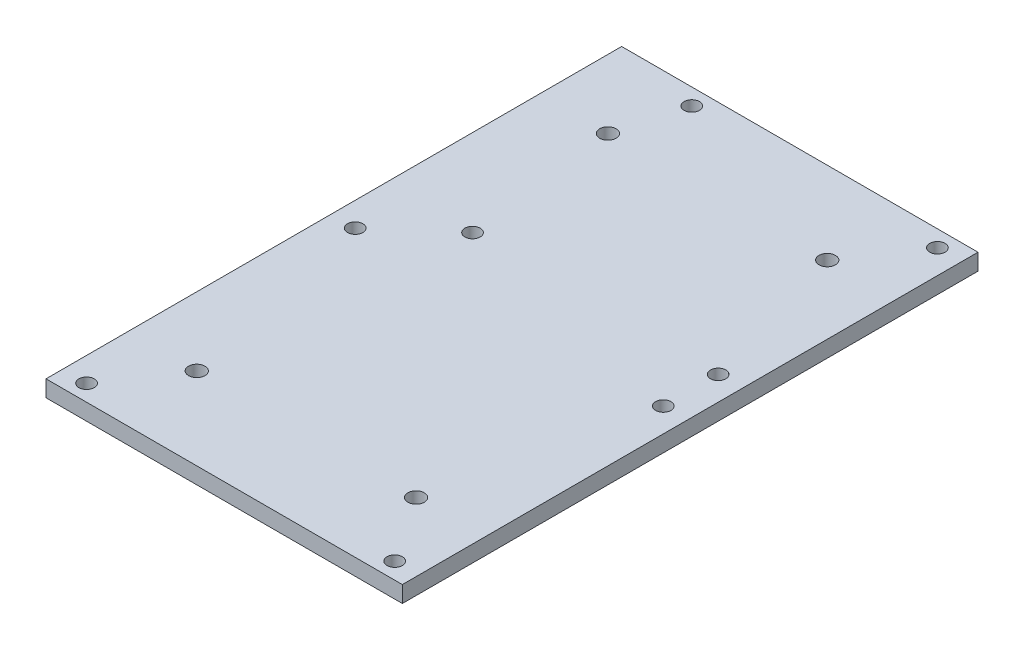
ISO-10303-21;
HEADER;
FILE_DESCRIPTION(('STEP AP214'),'2;1');
FILE_NAME('part.step','',(''),(''),'','','');
FILE_SCHEMA(('AUTOMOTIVE_DESIGN { 1 0 10303 214 1 1 1 1 }'));
ENDSEC;
DATA;
#1=APPLICATION_CONTEXT('core data for automotive mechanical design processes');
#2=APPLICATION_PROTOCOL_DEFINITION('international standard','automotive_design',2000,#1);
#3=PRODUCT_CONTEXT('',#1,'mechanical');
#4=PRODUCT('Part','Part','',(#3));
#5=PRODUCT_RELATED_PRODUCT_CATEGORY('part','',(#4));
#6=PRODUCT_DEFINITION_FORMATION('','',#4);
#7=PRODUCT_DEFINITION_CONTEXT('part definition',#1,'design');
#8=PRODUCT_DEFINITION('design','',#6,#7);
#9=PRODUCT_DEFINITION_SHAPE('','',#8);
#10=(LENGTH_UNIT() NAMED_UNIT(*) SI_UNIT(.MILLI.,.METRE.));
#11=(NAMED_UNIT(*) PLANE_ANGLE_UNIT() SI_UNIT($,.RADIAN.));
#12=(NAMED_UNIT(*) SI_UNIT($,.STERADIAN.) SOLID_ANGLE_UNIT());
#13=UNCERTAINTY_MEASURE_WITH_UNIT(LENGTH_MEASURE(1.E-05),#10,'distance_accuracy_value','');
#14=(GEOMETRIC_REPRESENTATION_CONTEXT(3) GLOBAL_UNCERTAINTY_ASSIGNED_CONTEXT((#13)) GLOBAL_UNIT_ASSIGNED_CONTEXT((#10,
#11,#12)) REPRESENTATION_CONTEXT('',''));
#15=CARTESIAN_POINT('',(0.,0.,0.));
#16=DIRECTION('',(0.,0.,1.));
#17=DIRECTION('',(1.,0.,0.));
#18=AXIS2_PLACEMENT_3D('',#15,#16,#17);
#19=CARTESIAN_POINT('',(32.5,3.,-52.5));
#20=DIRECTION('',(-1.,0.,0.));
#21=DIRECTION('',(0.,0.,1.));
#22=AXIS2_PLACEMENT_3D('',#19,#20,#21);
#23=PLANE('',#22);
#24=DIRECTION('',(0.,0.,-1.));
#25=VECTOR('',#24,1.);
#26=CARTESIAN_POINT('',(32.5,0.,-52.5));
#27=LINE('',#26,#25);
#28=CARTESIAN_POINT('',(32.5,0.,52.5));
#29=VERTEX_POINT('',#28);
#30=CARTESIAN_POINT('',(32.5,0.,-52.5));
#31=VERTEX_POINT('',#30);
#32=EDGE_CURVE('E100',#29,#31,#27,.T.);
#33=ORIENTED_EDGE('',*,*,#32,.T.);
#34=DIRECTION('',(0.,-1.,0.));
#35=VECTOR('',#34,1.);
#36=CARTESIAN_POINT('',(32.5,3.,-52.5));
#37=LINE('',#36,#35);
#38=CARTESIAN_POINT('',(32.5,3.,-52.5));
#39=VERTEX_POINT('',#38);
#40=EDGE_CURVE('E11',#39,#31,#37,.T.);
#41=ORIENTED_EDGE('',*,*,#40,.F.);
#42=DIRECTION('',(0.,0.,-1.));
#43=VECTOR('',#42,1.);
#44=CARTESIAN_POINT('',(32.5,3.,-52.5));
#45=LINE('',#44,#43);
#46=CARTESIAN_POINT('',(32.5,3.,52.5));
#47=VERTEX_POINT('',#46);
#48=EDGE_CURVE('E88',#47,#39,#45,.T.);
#49=ORIENTED_EDGE('',*,*,#48,.F.);
#50=DIRECTION('',(0.,-1.,0.));
#51=VECTOR('',#50,1.);
#52=CARTESIAN_POINT('',(32.5,3.,52.5));
#53=LINE('',#52,#51);
#54=EDGE_CURVE('E96',#47,#29,#53,.T.);
#55=ORIENTED_EDGE('',*,*,#54,.T.);
#56=EDGE_LOOP('',(#33,#41,#49,#55));
#57=FACE_BOUND('',#56,.T.);
#58=ADVANCED_FACE('F37',(#57),#23,.F.);
#59=CARTESIAN_POINT('',(-32.5,3.,-52.5));
#60=DIRECTION('',(0.,0.,1.));
#61=DIRECTION('',(1.,0.,0.));
#62=AXIS2_PLACEMENT_3D('',#59,#60,#61);
#63=PLANE('',#62);
#64=DIRECTION('',(-1.,0.,0.));
#65=VECTOR('',#64,1.);
#66=CARTESIAN_POINT('',(-32.5,0.,-52.5));
#67=LINE('',#66,#65);
#68=CARTESIAN_POINT('',(-32.5,0.,-52.5));
#69=VERTEX_POINT('',#68);
#70=EDGE_CURVE('E92',#31,#69,#67,.T.);
#71=ORIENTED_EDGE('',*,*,#70,.T.);
#72=DIRECTION('',(0.,-1.,0.));
#73=VECTOR('',#72,1.);
#74=CARTESIAN_POINT('',(-32.5,3.,-52.5));
#75=LINE('',#74,#73);
#76=CARTESIAN_POINT('',(-32.5,3.,-52.5));
#77=VERTEX_POINT('',#76);
#78=EDGE_CURVE('E45',#77,#69,#75,.T.);
#79=ORIENTED_EDGE('',*,*,#78,.F.);
#80=DIRECTION('',(-1.,0.,0.));
#81=VECTOR('',#80,1.);
#82=CARTESIAN_POINT('',(-32.5,3.,-52.5));
#83=LINE('',#82,#81);
#84=EDGE_CURVE('E83',#39,#77,#83,.T.);
#85=ORIENTED_EDGE('',*,*,#84,.F.);
#86=ORIENTED_EDGE('',*,*,#40,.T.);
#87=EDGE_LOOP('',(#71,#79,#85,#86));
#88=FACE_BOUND('',#87,.T.);
#89=ADVANCED_FACE('F91',(#88),#63,.F.);
#90=CARTESIAN_POINT('',(-32.5,3.,-52.5));
#91=DIRECTION('',(1.,0.,0.));
#92=DIRECTION('',(0.,0.,-1.));
#93=AXIS2_PLACEMENT_3D('',#90,#91,#92);
#94=PLANE('',#93);
#95=DIRECTION('',(0.,0.,1.));
#96=VECTOR('',#95,1.);
#97=CARTESIAN_POINT('',(-32.5,0.,-52.5));
#98=LINE('',#97,#96);
#99=CARTESIAN_POINT('',(-32.5,0.,52.5));
#100=VERTEX_POINT('',#99);
#101=EDGE_CURVE('E70',#69,#100,#98,.T.);
#102=ORIENTED_EDGE('',*,*,#101,.T.);
#103=DIRECTION('',(0.,-1.,0.));
#104=VECTOR('',#103,1.);
#105=CARTESIAN_POINT('',(-32.5,3.,52.5));
#106=LINE('',#105,#104);
#107=CARTESIAN_POINT('',(-32.5,3.,52.5));
#108=VERTEX_POINT('',#107);
#109=EDGE_CURVE('E93',#108,#100,#106,.T.);
#110=ORIENTED_EDGE('',*,*,#109,.F.);
#111=DIRECTION('',(0.,0.,1.));
#112=VECTOR('',#111,1.);
#113=CARTESIAN_POINT('',(-32.5,3.,-52.5));
#114=LINE('',#113,#112);
#115=EDGE_CURVE('E86',#77,#108,#114,.T.);
#116=ORIENTED_EDGE('',*,*,#115,.F.);
#117=ORIENTED_EDGE('',*,*,#78,.T.);
#118=EDGE_LOOP('',(#102,#110,#116,#117));
#119=FACE_BOUND('',#118,.T.);
#120=ADVANCED_FACE('F94',(#119),#94,.F.);
#121=CARTESIAN_POINT('',(-32.5,3.,52.5));
#122=DIRECTION('',(0.,0.,-1.));
#123=DIRECTION('',(-1.,0.,0.));
#124=AXIS2_PLACEMENT_3D('',#121,#122,#123);
#125=PLANE('',#124);
#126=DIRECTION('',(1.,0.,0.));
#127=VECTOR('',#126,1.);
#128=CARTESIAN_POINT('',(-32.5,0.,52.5));
#129=LINE('',#128,#127);
#130=EDGE_CURVE('E76',#100,#29,#129,.T.);
#131=ORIENTED_EDGE('',*,*,#130,.T.);
#132=ORIENTED_EDGE('',*,*,#54,.F.);
#133=DIRECTION('',(1.,0.,0.));
#134=VECTOR('',#133,1.);
#135=CARTESIAN_POINT('',(-32.5,3.,52.5));
#136=LINE('',#135,#134);
#137=EDGE_CURVE('E53',#108,#47,#136,.T.);
#138=ORIENTED_EDGE('',*,*,#137,.F.);
#139=ORIENTED_EDGE('',*,*,#109,.T.);
#140=EDGE_LOOP('',(#131,#132,#138,#139));
#141=FACE_BOUND('',#140,.T.);
#142=ADVANCED_FACE('F108',(#141),#125,.F.);
#143=CARTESIAN_POINT('',(0.,3.,0.));
#144=DIRECTION('',(0.,1.,0.));
#145=DIRECTION('',(0.,0.,1.));
#146=AXIS2_PLACEMENT_3D('',#143,#144,#145);
#147=PLANE('',#146);
#148=CARTESIAN_POINT('',(20.,3.,37.5));
#149=DIRECTION('',(0.,1.,0.));
#150=DIRECTION('',(0.,0.,1.));
#151=AXIS2_PLACEMENT_3D('',#148,#149,#150);
#152=CIRCLE('',#151,1.5);
#153=CARTESIAN_POINT('',(20.,3.,39.));
#154=VERTEX_POINT('',#153);
#155=EDGE_CURVE('E180',#154,#154,#152,.T.);
#156=ORIENTED_EDGE('',*,*,#155,.F.);
#157=EDGE_LOOP('',(#156));
#158=FACE_BOUND('',#157,.T.);
#159=CARTESIAN_POINT('',(20.,3.,-37.5));
#160=DIRECTION('',(0.,1.,0.));
#161=DIRECTION('',(0.,0.,1.));
#162=AXIS2_PLACEMENT_3D('',#159,#160,#161);
#163=CIRCLE('',#162,1.5);
#164=CARTESIAN_POINT('',(20.,3.,-36.));
#165=VERTEX_POINT('',#164);
#166=EDGE_CURVE('E174',#165,#165,#163,.T.);
#167=ORIENTED_EDGE('',*,*,#166,.F.);
#168=EDGE_LOOP('',(#167));
#169=FACE_BOUND('',#168,.T.);
#170=CARTESIAN_POINT('',(-20.,3.,-37.5));
#171=DIRECTION('',(0.,1.,0.));
#172=DIRECTION('',(0.,0.,1.));
#173=AXIS2_PLACEMENT_3D('',#170,#171,#172);
#174=CIRCLE('',#173,1.5);
#175=CARTESIAN_POINT('',(-20.,3.,-36.));
#176=VERTEX_POINT('',#175);
#177=EDGE_CURVE('E168',#176,#176,#174,.T.);
#178=ORIENTED_EDGE('',*,*,#177,.F.);
#179=EDGE_LOOP('',(#178));
#180=FACE_BOUND('',#179,.T.);
#181=CARTESIAN_POINT('',(-20.,3.,37.5));
#182=DIRECTION('',(0.,1.,0.));
#183=DIRECTION('',(0.,0.,1.));
#184=AXIS2_PLACEMENT_3D('',#181,#182,#183);
#185=CIRCLE('',#184,1.5);
#186=CARTESIAN_POINT('',(-20.,3.,39.));
#187=VERTEX_POINT('',#186);
#188=EDGE_CURVE('E162',#187,#187,#185,.T.);
#189=ORIENTED_EDGE('',*,*,#188,.F.);
#190=EDGE_LOOP('',(#189));
#191=FACE_BOUND('',#190,.T.);
#192=CARTESIAN_POINT('',(28.1000000000001,3.,-9.5));
#193=DIRECTION('',(0.,1.,0.));
#194=DIRECTION('',(0.,0.,1.));
#195=AXIS2_PLACEMENT_3D('',#192,#193,#194);
#196=CIRCLE('',#195,1.4);
#197=CARTESIAN_POINT('',(28.1000000000001,3.,-8.1));
#198=VERTEX_POINT('',#197);
#199=EDGE_CURVE('E157',#198,#198,#196,.T.);
#200=ORIENTED_EDGE('',*,*,#199,.F.);
#201=EDGE_LOOP('',(#200));
#202=FACE_BOUND('',#201,.T.);
#203=CARTESIAN_POINT('',(28.1000000000001,3.,-49.5));
#204=DIRECTION('',(0.,1.,0.));
#205=DIRECTION('',(0.,0.,1.));
#206=AXIS2_PLACEMENT_3D('',#203,#204,#205);
#207=CIRCLE('',#206,1.4);
#208=CARTESIAN_POINT('',(28.1000000000001,3.,-48.1));
#209=VERTEX_POINT('',#208);
#210=EDGE_CURVE('E151',#209,#209,#207,.T.);
#211=ORIENTED_EDGE('',*,*,#210,.F.);
#212=EDGE_LOOP('',(#211));
#213=FACE_BOUND('',#212,.T.);
#214=CARTESIAN_POINT('',(-16.6999999999999,3.,-49.5));
#215=DIRECTION('',(0.,1.,0.));
#216=DIRECTION('',(0.,0.,1.));
#217=AXIS2_PLACEMENT_3D('',#214,#215,#216);
#218=CIRCLE('',#217,1.4);
#219=CARTESIAN_POINT('',(-16.6999999999999,3.,-48.1));
#220=VERTEX_POINT('',#219);
#221=EDGE_CURVE('E144',#220,#220,#218,.T.);
#222=ORIENTED_EDGE('',*,*,#221,.F.);
#223=EDGE_LOOP('',(#222));
#224=FACE_BOUND('',#223,.T.);
#225=CARTESIAN_POINT('',(-16.6999999999999,3.,-9.5));
#226=DIRECTION('',(0.,1.,0.));
#227=DIRECTION('',(0.,0.,1.));
#228=AXIS2_PLACEMENT_3D('',#225,#226,#227);
#229=CIRCLE('',#228,1.4);
#230=CARTESIAN_POINT('',(-16.6999999999999,3.,-8.1));
#231=VERTEX_POINT('',#230);
#232=EDGE_CURVE('E138',#231,#231,#229,.T.);
#233=ORIENTED_EDGE('',*,*,#232,.F.);
#234=EDGE_LOOP('',(#233));
#235=FACE_BOUND('',#234,.T.);
#236=CARTESIAN_POINT('',(28.1000000000001,3.,49.5));
#237=DIRECTION('',(0.,1.,0.));
#238=DIRECTION('',(0.,0.,1.));
#239=AXIS2_PLACEMENT_3D('',#236,#237,#238);
#240=CIRCLE('',#239,1.4);
#241=CARTESIAN_POINT('',(28.1000000000001,3.,50.9));
#242=VERTEX_POINT('',#241);
#243=EDGE_CURVE('E133',#242,#242,#240,.T.);
#244=ORIENTED_EDGE('',*,*,#243,.F.);
#245=EDGE_LOOP('',(#244));
#246=FACE_BOUND('',#245,.T.);
#247=CARTESIAN_POINT('',(28.1000000000001,3.,0.499999999999987));
#248=DIRECTION('',(0.,1.,0.));
#249=DIRECTION('',(0.,0.,1.));
#250=AXIS2_PLACEMENT_3D('',#247,#248,#249);
#251=CIRCLE('',#250,1.4);
#252=CARTESIAN_POINT('',(28.1000000000001,3.,1.89999999999999));
#253=VERTEX_POINT('',#252);
#254=EDGE_CURVE('E127',#253,#253,#251,.T.);
#255=ORIENTED_EDGE('',*,*,#254,.F.);
#256=EDGE_LOOP('',(#255));
#257=FACE_BOUND('',#256,.T.);
#258=CARTESIAN_POINT('',(-28.0999999999999,3.,0.499999999999987));
#259=DIRECTION('',(0.,1.,0.));
#260=DIRECTION('',(0.,0.,1.));
#261=AXIS2_PLACEMENT_3D('',#258,#259,#260);
#262=CIRCLE('',#261,1.4);
#263=CARTESIAN_POINT('',(-28.0999999999999,3.,1.89999999999999));
#264=VERTEX_POINT('',#263);
#265=EDGE_CURVE('E120',#264,#264,#262,.T.);
#266=ORIENTED_EDGE('',*,*,#265,.F.);
#267=EDGE_LOOP('',(#266));
#268=FACE_BOUND('',#267,.T.);
#269=CARTESIAN_POINT('',(-28.0999999999999,3.,49.5));
#270=DIRECTION('',(0.,1.,0.));
#271=DIRECTION('',(0.,0.,1.));
#272=AXIS2_PLACEMENT_3D('',#269,#270,#271);
#273=CIRCLE('',#272,1.4);
#274=CARTESIAN_POINT('',(-28.0999999999999,3.,50.9));
#275=VERTEX_POINT('',#274);
#276=EDGE_CURVE('E114',#275,#275,#273,.T.);
#277=ORIENTED_EDGE('',*,*,#276,.F.);
#278=EDGE_LOOP('',(#277));
#279=FACE_BOUND('',#278,.T.);
#280=ORIENTED_EDGE('',*,*,#48,.T.);
#281=ORIENTED_EDGE('',*,*,#84,.T.);
#282=ORIENTED_EDGE('',*,*,#115,.T.);
#283=ORIENTED_EDGE('',*,*,#137,.T.);
#284=EDGE_LOOP('',(#280,#281,#282,#283));
#285=FACE_BOUND('',#284,.T.);
#286=ADVANCED_FACE('F84',(#158,#169,#180,#191,#202,#213,#224,#235,#246,#257,#268,#279,#285),
#147,.T.);
#287=CARTESIAN_POINT('',(0.,0.,0.));
#288=DIRECTION('',(0.,1.,0.));
#289=DIRECTION('',(0.,0.,1.));
#290=AXIS2_PLACEMENT_3D('',#287,#288,#289);
#291=PLANE('',#290);
#292=CARTESIAN_POINT('',(20.,0.,37.5));
#293=DIRECTION('',(0.,1.,0.));
#294=DIRECTION('',(0.,0.,1.));
#295=AXIS2_PLACEMENT_3D('',#292,#293,#294);
#296=CIRCLE('',#295,1.5);
#297=CARTESIAN_POINT('',(20.,0.,39.));
#298=VERTEX_POINT('',#297);
#299=EDGE_CURVE('E165',#298,#298,#296,.T.);
#300=ORIENTED_EDGE('',*,*,#299,.T.);
#301=EDGE_LOOP('',(#300));
#302=FACE_BOUND('',#301,.T.);
#303=CARTESIAN_POINT('',(20.,0.,-37.5));
#304=DIRECTION('',(0.,1.,0.));
#305=DIRECTION('',(0.,0.,1.));
#306=AXIS2_PLACEMENT_3D('',#303,#304,#305);
#307=CIRCLE('',#306,1.5);
#308=CARTESIAN_POINT('',(20.,0.,-36.));
#309=VERTEX_POINT('',#308);
#310=EDGE_CURVE('E177',#309,#309,#307,.T.);
#311=ORIENTED_EDGE('',*,*,#310,.T.);
#312=EDGE_LOOP('',(#311));
#313=FACE_BOUND('',#312,.T.);
#314=CARTESIAN_POINT('',(-20.,0.,-37.5));
#315=DIRECTION('',(0.,1.,0.));
#316=DIRECTION('',(0.,0.,1.));
#317=AXIS2_PLACEMENT_3D('',#314,#315,#316);
#318=CIRCLE('',#317,1.5);
#319=CARTESIAN_POINT('',(-20.,0.,-36.));
#320=VERTEX_POINT('',#319);
#321=EDGE_CURVE('E171',#320,#320,#318,.T.);
#322=ORIENTED_EDGE('',*,*,#321,.T.);
#323=EDGE_LOOP('',(#322));
#324=FACE_BOUND('',#323,.T.);
#325=CARTESIAN_POINT('',(-20.,0.,37.5));
#326=DIRECTION('',(0.,1.,0.));
#327=DIRECTION('',(0.,0.,1.));
#328=AXIS2_PLACEMENT_3D('',#325,#326,#327);
#329=CIRCLE('',#328,1.5);
#330=CARTESIAN_POINT('',(-20.,0.,39.));
#331=VERTEX_POINT('',#330);
#332=EDGE_CURVE('E148',#331,#331,#329,.T.);
#333=ORIENTED_EDGE('',*,*,#332,.T.);
#334=EDGE_LOOP('',(#333));
#335=FACE_BOUND('',#334,.T.);
#336=CARTESIAN_POINT('',(28.1000000000001,0.,-9.5));
#337=DIRECTION('',(0.,1.,0.));
#338=DIRECTION('',(0.,0.,1.));
#339=AXIS2_PLACEMENT_3D('',#336,#337,#338);
#340=CIRCLE('',#339,1.4);
#341=CARTESIAN_POINT('',(28.1000000000001,0.,-8.1));
#342=VERTEX_POINT('',#341);
#343=EDGE_CURVE('E141',#342,#342,#340,.T.);
#344=ORIENTED_EDGE('',*,*,#343,.T.);
#345=EDGE_LOOP('',(#344));
#346=FACE_BOUND('',#345,.T.);
#347=CARTESIAN_POINT('',(28.1000000000001,0.,-49.5));
#348=DIRECTION('',(0.,1.,0.));
#349=DIRECTION('',(0.,0.,1.));
#350=AXIS2_PLACEMENT_3D('',#347,#348,#349);
#351=CIRCLE('',#350,1.4);
#352=CARTESIAN_POINT('',(28.1000000000001,0.,-48.1));
#353=VERTEX_POINT('',#352);
#354=EDGE_CURVE('E154',#353,#353,#351,.T.);
#355=ORIENTED_EDGE('',*,*,#354,.T.);
#356=EDGE_LOOP('',(#355));
#357=FACE_BOUND('',#356,.T.);
#358=CARTESIAN_POINT('',(-16.6999999999999,0.,-49.5));
#359=DIRECTION('',(0.,1.,0.));
#360=DIRECTION('',(0.,0.,1.));
#361=AXIS2_PLACEMENT_3D('',#358,#359,#360);
#362=CIRCLE('',#361,1.4);
#363=CARTESIAN_POINT('',(-16.6999999999999,0.,-48.1));
#364=VERTEX_POINT('',#363);
#365=EDGE_CURVE('E147',#364,#364,#362,.T.);
#366=ORIENTED_EDGE('',*,*,#365,.T.);
#367=EDGE_LOOP('',(#366));
#368=FACE_BOUND('',#367,.T.);
#369=CARTESIAN_POINT('',(-16.6999999999999,0.,-9.5));
#370=DIRECTION('',(0.,1.,0.));
#371=DIRECTION('',(0.,0.,1.));
#372=AXIS2_PLACEMENT_3D('',#369,#370,#371);
#373=CIRCLE('',#372,1.4);
#374=CARTESIAN_POINT('',(-16.6999999999999,0.,-8.1));
#375=VERTEX_POINT('',#374);
#376=EDGE_CURVE('E124',#375,#375,#373,.T.);
#377=ORIENTED_EDGE('',*,*,#376,.T.);
#378=EDGE_LOOP('',(#377));
#379=FACE_BOUND('',#378,.T.);
#380=CARTESIAN_POINT('',(28.1000000000001,0.,49.5));
#381=DIRECTION('',(0.,1.,0.));
#382=DIRECTION('',(0.,0.,1.));
#383=AXIS2_PLACEMENT_3D('',#380,#381,#382);
#384=CIRCLE('',#383,1.4);
#385=CARTESIAN_POINT('',(28.1000000000001,0.,50.9));
#386=VERTEX_POINT('',#385);
#387=EDGE_CURVE('E117',#386,#386,#384,.T.);
#388=ORIENTED_EDGE('',*,*,#387,.T.);
#389=EDGE_LOOP('',(#388));
#390=FACE_BOUND('',#389,.T.);
#391=CARTESIAN_POINT('',(28.1000000000001,0.,0.499999999999987));
#392=DIRECTION('',(0.,1.,0.));
#393=DIRECTION('',(0.,0.,1.));
#394=AXIS2_PLACEMENT_3D('',#391,#392,#393);
#395=CIRCLE('',#394,1.4);
#396=CARTESIAN_POINT('',(28.1000000000001,0.,1.89999999999999));
#397=VERTEX_POINT('',#396);
#398=EDGE_CURVE('E130',#397,#397,#395,.T.);
#399=ORIENTED_EDGE('',*,*,#398,.T.);
#400=EDGE_LOOP('',(#399));
#401=FACE_BOUND('',#400,.T.);
#402=CARTESIAN_POINT('',(-28.0999999999999,0.,0.499999999999987));
#403=DIRECTION('',(0.,1.,0.));
#404=DIRECTION('',(0.,0.,1.));
#405=AXIS2_PLACEMENT_3D('',#402,#403,#404);
#406=CIRCLE('',#405,1.4);
#407=CARTESIAN_POINT('',(-28.0999999999999,0.,1.89999999999999));
#408=VERTEX_POINT('',#407);
#409=EDGE_CURVE('E123',#408,#408,#406,.T.);
#410=ORIENTED_EDGE('',*,*,#409,.T.);
#411=EDGE_LOOP('',(#410));
#412=FACE_BOUND('',#411,.T.);
#413=CARTESIAN_POINT('',(-28.0999999999999,0.,49.5));
#414=DIRECTION('',(0.,1.,0.));
#415=DIRECTION('',(0.,0.,1.));
#416=AXIS2_PLACEMENT_3D('',#413,#414,#415);
#417=CIRCLE('',#416,1.4);
#418=CARTESIAN_POINT('',(-28.0999999999999,0.,50.9));
#419=VERTEX_POINT('',#418);
#420=EDGE_CURVE('E103',#419,#419,#417,.T.);
#421=ORIENTED_EDGE('',*,*,#420,.T.);
#422=EDGE_LOOP('',(#421));
#423=FACE_BOUND('',#422,.T.);
#424=ORIENTED_EDGE('',*,*,#32,.F.);
#425=ORIENTED_EDGE('',*,*,#130,.F.);
#426=ORIENTED_EDGE('',*,*,#101,.F.);
#427=ORIENTED_EDGE('',*,*,#70,.F.);
#428=EDGE_LOOP('',(#424,#425,#426,#427));
#429=FACE_BOUND('',#428,.T.);
#430=ADVANCED_FACE('F111',(#302,#313,#324,#335,#346,#357,#368,#379,#390,#401,#412,#423,#429),
#291,.F.);
#431=CARTESIAN_POINT('',(-28.0999999999999,0.,49.5));
#432=DIRECTION('',(0.,1.,0.));
#433=DIRECTION('',(0.,0.,1.));
#434=AXIS2_PLACEMENT_3D('',#431,#432,#433);
#435=CYLINDRICAL_SURFACE('',#434,1.4);
#436=ORIENTED_EDGE('',*,*,#420,.F.);
#437=EDGE_LOOP('',(#436));
#438=FACE_BOUND('',#437,.T.);
#439=ORIENTED_EDGE('',*,*,#276,.T.);
#440=EDGE_LOOP('',(#439));
#441=FACE_BOUND('',#440,.T.);
#442=ADVANCED_FACE('F220',(#438,#441),#435,.F.);
#443=CARTESIAN_POINT('',(-28.0999999999999,0.,0.499999999999987));
#444=DIRECTION('',(0.,1.,0.));
#445=DIRECTION('',(0.,0.,1.));
#446=AXIS2_PLACEMENT_3D('',#443,#444,#445);
#447=CYLINDRICAL_SURFACE('',#446,1.4);
#448=ORIENTED_EDGE('',*,*,#409,.F.);
#449=EDGE_LOOP('',(#448));
#450=FACE_BOUND('',#449,.T.);
#451=ORIENTED_EDGE('',*,*,#265,.T.);
#452=EDGE_LOOP('',(#451));
#453=FACE_BOUND('',#452,.T.);
#454=ADVANCED_FACE('F222',(#450,#453),#447,.F.);
#455=CARTESIAN_POINT('',(28.1000000000001,0.,0.499999999999987));
#456=DIRECTION('',(0.,1.,0.));
#457=DIRECTION('',(0.,0.,1.));
#458=AXIS2_PLACEMENT_3D('',#455,#456,#457);
#459=CYLINDRICAL_SURFACE('',#458,1.4);
#460=ORIENTED_EDGE('',*,*,#398,.F.);
#461=EDGE_LOOP('',(#460));
#462=FACE_BOUND('',#461,.T.);
#463=ORIENTED_EDGE('',*,*,#254,.T.);
#464=EDGE_LOOP('',(#463));
#465=FACE_BOUND('',#464,.T.);
#466=ADVANCED_FACE('F229',(#462,#465),#459,.F.);
#467=CARTESIAN_POINT('',(28.1000000000001,0.,49.5));
#468=DIRECTION('',(0.,1.,0.));
#469=DIRECTION('',(0.,0.,1.));
#470=AXIS2_PLACEMENT_3D('',#467,#468,#469);
#471=CYLINDRICAL_SURFACE('',#470,1.4);
#472=ORIENTED_EDGE('',*,*,#387,.F.);
#473=EDGE_LOOP('',(#472));
#474=FACE_BOUND('',#473,.T.);
#475=ORIENTED_EDGE('',*,*,#243,.T.);
#476=EDGE_LOOP('',(#475));
#477=FACE_BOUND('',#476,.T.);
#478=ADVANCED_FACE('F316',(#474,#477),#471,.F.);
#479=CARTESIAN_POINT('',(-16.6999999999999,0.,-9.5));
#480=DIRECTION('',(0.,1.,0.));
#481=DIRECTION('',(0.,0.,1.));
#482=AXIS2_PLACEMENT_3D('',#479,#480,#481);
#483=CYLINDRICAL_SURFACE('',#482,1.4);
#484=ORIENTED_EDGE('',*,*,#376,.F.);
#485=EDGE_LOOP('',(#484));
#486=FACE_BOUND('',#485,.T.);
#487=ORIENTED_EDGE('',*,*,#232,.T.);
#488=EDGE_LOOP('',(#487));
#489=FACE_BOUND('',#488,.T.);
#490=ADVANCED_FACE('F312',(#486,#489),#483,.F.);
#491=CARTESIAN_POINT('',(-16.6999999999999,0.,-49.5));
#492=DIRECTION('',(0.,1.,0.));
#493=DIRECTION('',(0.,0.,1.));
#494=AXIS2_PLACEMENT_3D('',#491,#492,#493);
#495=CYLINDRICAL_SURFACE('',#494,1.4);
#496=ORIENTED_EDGE('',*,*,#365,.F.);
#497=EDGE_LOOP('',(#496));
#498=FACE_BOUND('',#497,.T.);
#499=ORIENTED_EDGE('',*,*,#221,.T.);
#500=EDGE_LOOP('',(#499));
#501=FACE_BOUND('',#500,.T.);
#502=ADVANCED_FACE('F308',(#498,#501),#495,.F.);
#503=CARTESIAN_POINT('',(28.1000000000001,0.,-49.5));
#504=DIRECTION('',(0.,1.,0.));
#505=DIRECTION('',(0.,0.,1.));
#506=AXIS2_PLACEMENT_3D('',#503,#504,#505);
#507=CYLINDRICAL_SURFACE('',#506,1.4);
#508=ORIENTED_EDGE('',*,*,#354,.F.);
#509=EDGE_LOOP('',(#508));
#510=FACE_BOUND('',#509,.T.);
#511=ORIENTED_EDGE('',*,*,#210,.T.);
#512=EDGE_LOOP('',(#511));
#513=FACE_BOUND('',#512,.T.);
#514=ADVANCED_FACE('F304',(#510,#513),#507,.F.);
#515=CARTESIAN_POINT('',(28.1000000000001,0.,-9.5));
#516=DIRECTION('',(0.,1.,0.));
#517=DIRECTION('',(0.,0.,1.));
#518=AXIS2_PLACEMENT_3D('',#515,#516,#517);
#519=CYLINDRICAL_SURFACE('',#518,1.4);
#520=ORIENTED_EDGE('',*,*,#343,.F.);
#521=EDGE_LOOP('',(#520));
#522=FACE_BOUND('',#521,.T.);
#523=ORIENTED_EDGE('',*,*,#199,.T.);
#524=EDGE_LOOP('',(#523));
#525=FACE_BOUND('',#524,.T.);
#526=ADVANCED_FACE('F269',(#522,#525),#519,.F.);
#527=CARTESIAN_POINT('',(-20.,0.,37.5));
#528=DIRECTION('',(0.,1.,0.));
#529=DIRECTION('',(0.,0.,1.));
#530=AXIS2_PLACEMENT_3D('',#527,#528,#529);
#531=CYLINDRICAL_SURFACE('',#530,1.5);
#532=ORIENTED_EDGE('',*,*,#332,.F.);
#533=EDGE_LOOP('',(#532));
#534=FACE_BOUND('',#533,.T.);
#535=ORIENTED_EDGE('',*,*,#188,.T.);
#536=EDGE_LOOP('',(#535));
#537=FACE_BOUND('',#536,.T.);
#538=ADVANCED_FACE('F263',(#534,#537),#531,.F.);
#539=CARTESIAN_POINT('',(-20.,0.,-37.5));
#540=DIRECTION('',(0.,1.,0.));
#541=DIRECTION('',(0.,0.,1.));
#542=AXIS2_PLACEMENT_3D('',#539,#540,#541);
#543=CYLINDRICAL_SURFACE('',#542,1.5);
#544=ORIENTED_EDGE('',*,*,#321,.F.);
#545=EDGE_LOOP('',(#544));
#546=FACE_BOUND('',#545,.T.);
#547=ORIENTED_EDGE('',*,*,#177,.T.);
#548=EDGE_LOOP('',(#547));
#549=FACE_BOUND('',#548,.T.);
#550=ADVANCED_FACE('F268',(#546,#549),#543,.F.);
#551=CARTESIAN_POINT('',(20.,0.,-37.5));
#552=DIRECTION('',(0.,1.,0.));
#553=DIRECTION('',(0.,0.,1.));
#554=AXIS2_PLACEMENT_3D('',#551,#552,#553);
#555=CYLINDRICAL_SURFACE('',#554,1.5);
#556=ORIENTED_EDGE('',*,*,#310,.F.);
#557=EDGE_LOOP('',(#556));
#558=FACE_BOUND('',#557,.T.);
#559=ORIENTED_EDGE('',*,*,#166,.T.);
#560=EDGE_LOOP('',(#559));
#561=FACE_BOUND('',#560,.T.);
#562=ADVANCED_FACE('F191',(#558,#561),#555,.F.);
#563=CARTESIAN_POINT('',(20.,0.,37.5));
#564=DIRECTION('',(0.,1.,0.));
#565=DIRECTION('',(0.,0.,1.));
#566=AXIS2_PLACEMENT_3D('',#563,#564,#565);
#567=CYLINDRICAL_SURFACE('',#566,1.5);
#568=ORIENTED_EDGE('',*,*,#299,.F.);
#569=EDGE_LOOP('',(#568));
#570=FACE_BOUND('',#569,.T.);
#571=ORIENTED_EDGE('',*,*,#155,.T.);
#572=EDGE_LOOP('',(#571));
#573=FACE_BOUND('',#572,.T.);
#574=ADVANCED_FACE('F188',(#570,#573),#567,.F.);
#575=CLOSED_SHELL('',(#58,#89,#120,#142,#286,#430,#442,#454,#466,#478,#490,#502,#514,#526,#538,
#550,#562,#574));
#576=MANIFOLD_SOLID_BREP('B2',#575);
#577=ADVANCED_BREP_SHAPE_REPRESENTATION('',(#18,#576),#14);
#578=SHAPE_DEFINITION_REPRESENTATION(#9,#577);
ENDSEC;
END-ISO-10303-21;
